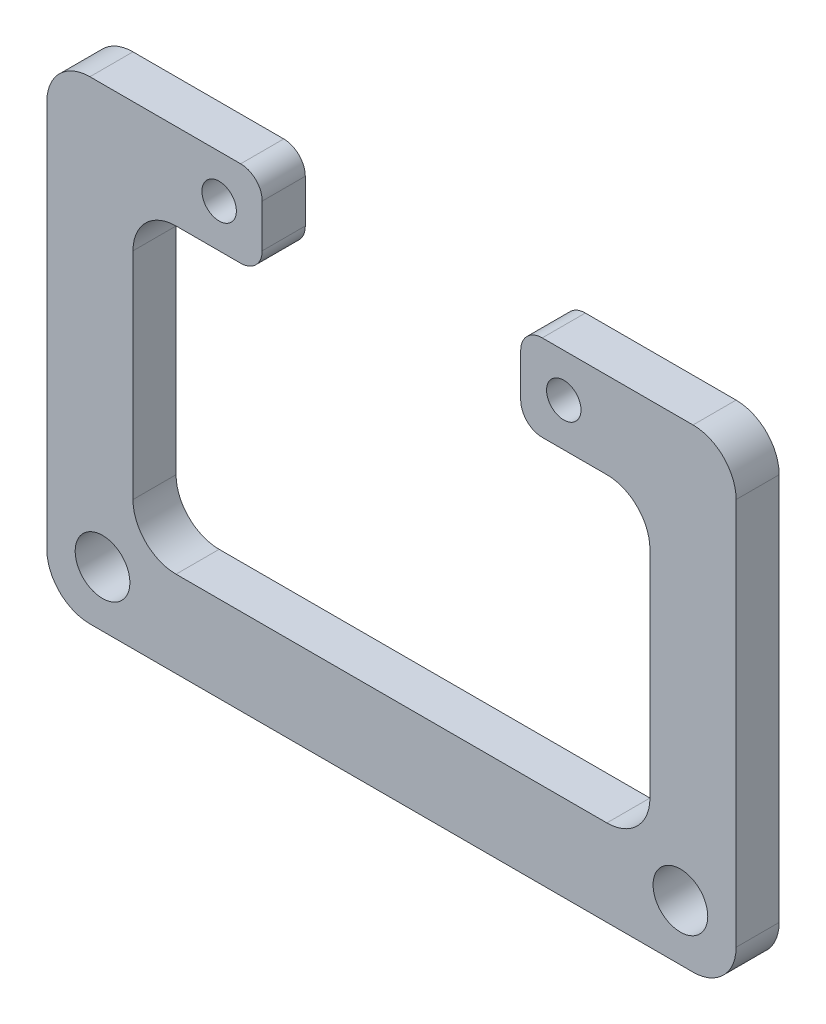
ISO-10303-21;
HEADER;
FILE_DESCRIPTION(('STEP AP214'),'2;1');
FILE_NAME('part.step','',(''),(''),'','','');
FILE_SCHEMA(('AUTOMOTIVE_DESIGN { 1 0 10303 214 1 1 1 1 }'));
ENDSEC;
DATA;
#1=APPLICATION_CONTEXT('core data for automotive mechanical design processes');
#2=APPLICATION_PROTOCOL_DEFINITION('international standard','automotive_design',2000,#1);
#3=PRODUCT_CONTEXT('',#1,'mechanical');
#4=PRODUCT('Part','Part','',(#3));
#5=PRODUCT_RELATED_PRODUCT_CATEGORY('part','',(#4));
#6=PRODUCT_DEFINITION_FORMATION('','',#4);
#7=PRODUCT_DEFINITION_CONTEXT('part definition',#1,'design');
#8=PRODUCT_DEFINITION('design','',#6,#7);
#9=PRODUCT_DEFINITION_SHAPE('','',#8);
#10=(LENGTH_UNIT() NAMED_UNIT(*) SI_UNIT(.MILLI.,.METRE.));
#11=(NAMED_UNIT(*) PLANE_ANGLE_UNIT() SI_UNIT($,.RADIAN.));
#12=(NAMED_UNIT(*) SI_UNIT($,.STERADIAN.) SOLID_ANGLE_UNIT());
#13=UNCERTAINTY_MEASURE_WITH_UNIT(LENGTH_MEASURE(1.E-05),#10,'distance_accuracy_value','');
#14=(GEOMETRIC_REPRESENTATION_CONTEXT(3) GLOBAL_UNCERTAINTY_ASSIGNED_CONTEXT((#13)) GLOBAL_UNIT_ASSIGNED_CONTEXT((#10,
#11,#12)) REPRESENTATION_CONTEXT('',''));
#15=CARTESIAN_POINT('',(0.,0.,0.));
#16=DIRECTION('',(0.,0.,1.));
#17=DIRECTION('',(1.,0.,0.));
#18=AXIS2_PLACEMENT_3D('',#15,#16,#17);
#19=CARTESIAN_POINT('',(0.,0.,-5.));
#20=DIRECTION('',(0.,-1.,0.));
#21=DIRECTION('',(0.,0.,-1.));
#22=AXIS2_PLACEMENT_3D('',#19,#20,#21);
#23=PLANE('',#22);
#24=DIRECTION('',(1.,0.,0.));
#25=VECTOR('',#24,1.);
#26=CARTESIAN_POINT('',(0.,0.,5.));
#27=LINE('',#26,#25);
#28=CARTESIAN_POINT('',(-70.,0.,5.));
#29=VERTEX_POINT('',#28);
#30=CARTESIAN_POINT('',(70.,0.,5.));
#31=VERTEX_POINT('',#30);
#32=EDGE_CURVE('E353',#29,#31,#27,.T.);
#33=ORIENTED_EDGE('',*,*,#32,.F.);
#34=DIRECTION('',(0.,0.,1.));
#35=VECTOR('',#34,1.);
#36=CARTESIAN_POINT('',(-70.,0.,-5.));
#37=LINE('',#36,#35);
#38=CARTESIAN_POINT('',(-70.,0.,-5.));
#39=VERTEX_POINT('',#38);
#40=EDGE_CURVE('E302',#39,#29,#37,.T.);
#41=ORIENTED_EDGE('',*,*,#40,.F.);
#42=DIRECTION('',(1.,0.,0.));
#43=VECTOR('',#42,1.);
#44=CARTESIAN_POINT('',(0.,0.,-5.));
#45=LINE('',#44,#43);
#46=CARTESIAN_POINT('',(70.,0.,-5.));
#47=VERTEX_POINT('',#46);
#48=EDGE_CURVE('E317',#39,#47,#45,.T.);
#49=ORIENTED_EDGE('',*,*,#48,.T.);
#50=DIRECTION('',(0.,0.,1.));
#51=VECTOR('',#50,1.);
#52=CARTESIAN_POINT('',(70.,0.,-5.));
#53=LINE('',#52,#51);
#54=EDGE_CURVE('E349',#47,#31,#53,.T.);
#55=ORIENTED_EDGE('',*,*,#54,.T.);
#56=EDGE_LOOP('',(#33,#41,#49,#55));
#57=FACE_BOUND('',#56,.T.);
#58=ADVANCED_FACE('F47',(#57),#23,.T.);
#59=CARTESIAN_POINT('',(0.,20.,-5.));
#60=DIRECTION('',(0.,1.,0.));
#61=DIRECTION('',(-1.,0.,0.));
#62=AXIS2_PLACEMENT_3D('',#59,#60,#61);
#63=PLANE('',#62);
#64=DIRECTION('',(-1.,0.,0.));
#65=VECTOR('',#64,1.);
#66=CARTESIAN_POINT('',(0.,20.,5.));
#67=LINE('',#66,#65);
#68=CARTESIAN_POINT('',(50.,20.,5.));
#69=VERTEX_POINT('',#68);
#70=CARTESIAN_POINT('',(-50.,20.,5.));
#71=VERTEX_POINT('',#70);
#72=EDGE_CURVE('E383',#69,#71,#67,.T.);
#73=ORIENTED_EDGE('',*,*,#72,.F.);
#74=DIRECTION('',(0.,0.,1.));
#75=VECTOR('',#74,1.);
#76=CARTESIAN_POINT('',(50.,20.,-5.));
#77=LINE('',#76,#75);
#78=CARTESIAN_POINT('',(50.,20.,-5.));
#79=VERTEX_POINT('',#78);
#80=EDGE_CURVE('E217',#79,#69,#77,.T.);
#81=ORIENTED_EDGE('',*,*,#80,.F.);
#82=DIRECTION('',(-1.,0.,0.));
#83=VECTOR('',#82,1.);
#84=CARTESIAN_POINT('',(0.,20.,-5.));
#85=LINE('',#84,#83);
#86=CARTESIAN_POINT('',(-50.,20.,-5.));
#87=VERTEX_POINT('',#86);
#88=EDGE_CURVE('E211',#79,#87,#85,.T.);
#89=ORIENTED_EDGE('',*,*,#88,.T.);
#90=DIRECTION('',(0.,0.,1.));
#91=VECTOR('',#90,1.);
#92=CARTESIAN_POINT('',(-50.,20.,-5.));
#93=LINE('',#92,#91);
#94=EDGE_CURVE('E215',#87,#71,#93,.T.);
#95=ORIENTED_EDGE('',*,*,#94,.T.);
#96=EDGE_LOOP('',(#73,#81,#89,#95));
#97=FACE_BOUND('',#96,.T.);
#98=ADVANCED_FACE('F214',(#97),#63,.T.);
#99=CARTESIAN_POINT('',(50.,30.,-5.));
#100=DIRECTION('',(0.,0.,1.));
#101=DIRECTION('',(1.,0.,0.));
#102=AXIS2_PLACEMENT_3D('',#99,#100,#101);
#103=CYLINDRICAL_SURFACE('',#102,10.);
#104=CARTESIAN_POINT('',(50.,30.,5.));
#105=DIRECTION('',(0.,0.,1.));
#106=DIRECTION('',(1.,0.,0.));
#107=AXIS2_PLACEMENT_3D('',#104,#105,#106);
#108=CIRCLE('',#107,10.);
#109=CARTESIAN_POINT('',(60.,30.,5.));
#110=VERTEX_POINT('',#109);
#111=EDGE_CURVE('E379',#69,#110,#108,.T.);
#112=ORIENTED_EDGE('',*,*,#111,.T.);
#113=DIRECTION('',(0.,0.,1.));
#114=VECTOR('',#113,1.);
#115=CARTESIAN_POINT('',(60.,30.,-5.));
#116=LINE('',#115,#114);
#117=CARTESIAN_POINT('',(60.,30.,-5.));
#118=VERTEX_POINT('',#117);
#119=EDGE_CURVE('E392',#118,#110,#116,.T.);
#120=ORIENTED_EDGE('',*,*,#119,.F.);
#121=CARTESIAN_POINT('',(50.,30.,-5.));
#122=DIRECTION('',(0.,0.,1.));
#123=DIRECTION('',(1.,0.,0.));
#124=AXIS2_PLACEMENT_3D('',#121,#122,#123);
#125=CIRCLE('',#124,10.);
#126=EDGE_CURVE('E223',#79,#118,#125,.T.);
#127=ORIENTED_EDGE('',*,*,#126,.F.);
#128=ORIENTED_EDGE('',*,*,#80,.T.);
#129=EDGE_LOOP('',(#112,#120,#127,#128));
#130=FACE_BOUND('',#129,.T.);
#131=ADVANCED_FACE('F534',(#130),#103,.F.);
#132=CARTESIAN_POINT('',(60.,0.,-5.));
#133=DIRECTION('',(-1.,0.,0.));
#134=DIRECTION('',(0.,-1.,0.));
#135=AXIS2_PLACEMENT_3D('',#132,#133,#134);
#136=PLANE('',#135);
#137=DIRECTION('',(0.,-1.,0.));
#138=VECTOR('',#137,1.);
#139=CARTESIAN_POINT('',(60.,0.,5.));
#140=LINE('',#139,#138);
#141=CARTESIAN_POINT('',(60.,80.,5.));
#142=VERTEX_POINT('',#141);
#143=EDGE_CURVE('E376',#142,#110,#140,.T.);
#144=ORIENTED_EDGE('',*,*,#143,.F.);
#145=DIRECTION('',(0.,0.,1.));
#146=VECTOR('',#145,1.);
#147=CARTESIAN_POINT('',(60.,80.,-5.));
#148=LINE('',#147,#146);
#149=CARTESIAN_POINT('',(60.,80.,-5.));
#150=VERTEX_POINT('',#149);
#151=EDGE_CURVE('E423',#142,#150,#148,.F.);
#152=ORIENTED_EDGE('',*,*,#151,.T.);
#153=DIRECTION('',(0.,-1.,0.));
#154=VECTOR('',#153,1.);
#155=CARTESIAN_POINT('',(60.,0.,-5.));
#156=LINE('',#155,#154);
#157=EDGE_CURVE('E341',#150,#118,#156,.T.);
#158=ORIENTED_EDGE('',*,*,#157,.T.);
#159=ORIENTED_EDGE('',*,*,#119,.T.);
#160=EDGE_LOOP('',(#144,#152,#158,#159));
#161=FACE_BOUND('',#160,.T.);
#162=ADVANCED_FACE('F780',(#161),#136,.T.);
#163=CARTESIAN_POINT('',(0.,90.,-5.));
#164=DIRECTION('',(0.,-1.,0.));
#165=DIRECTION('',(1.,0.,0.));
#166=AXIS2_PLACEMENT_3D('',#163,#164,#165);
#167=PLANE('',#166);
#168=DIRECTION('',(1.,0.,0.));
#169=VECTOR('',#168,1.);
#170=CARTESIAN_POINT('',(0.,90.,5.));
#171=LINE('',#170,#169);
#172=CARTESIAN_POINT('',(35.,90.,5.));
#173=VERTEX_POINT('',#172);
#174=CARTESIAN_POINT('',(50.,90.,5.));
#175=VERTEX_POINT('',#174);
#176=EDGE_CURVE('E373',#173,#175,#171,.T.);
#177=ORIENTED_EDGE('',*,*,#176,.F.);
#178=DIRECTION('',(0.,0.,1.));
#179=VECTOR('',#178,1.);
#180=CARTESIAN_POINT('',(35.,90.,-5.));
#181=LINE('',#180,#179);
#182=CARTESIAN_POINT('',(35.,90.,-5.));
#183=VERTEX_POINT('',#182);
#184=EDGE_CURVE('E63',#173,#183,#181,.F.);
#185=ORIENTED_EDGE('',*,*,#184,.T.);
#186=DIRECTION('',(1.,0.,0.));
#187=VECTOR('',#186,1.);
#188=CARTESIAN_POINT('',(0.,90.,-5.));
#189=LINE('',#188,#187);
#190=CARTESIAN_POINT('',(50.,90.,-5.));
#191=VERTEX_POINT('',#190);
#192=EDGE_CURVE('E338',#183,#191,#189,.T.);
#193=ORIENTED_EDGE('',*,*,#192,.T.);
#194=DIRECTION('',(0.,0.,1.));
#195=VECTOR('',#194,1.);
#196=CARTESIAN_POINT('',(50.,90.,5.));
#197=LINE('',#196,#195);
#198=EDGE_CURVE('E419',#191,#175,#197,.T.);
#199=ORIENTED_EDGE('',*,*,#198,.T.);
#200=EDGE_LOOP('',(#177,#185,#193,#199));
#201=FACE_BOUND('',#200,.T.);
#202=ADVANCED_FACE('F543',(#201),#167,.T.);
#203=CARTESIAN_POINT('',(30.,0.,-5.));
#204=DIRECTION('',(-1.,0.,0.));
#205=DIRECTION('',(0.,0.,1.));
#206=AXIS2_PLACEMENT_3D('',#203,#204,#205);
#207=PLANE('',#206);
#208=DIRECTION('',(0.,-1.,0.));
#209=VECTOR('',#208,1.);
#210=CARTESIAN_POINT('',(30.,0.,5.));
#211=LINE('',#210,#209);
#212=CARTESIAN_POINT('',(30.,105.,5.));
#213=VERTEX_POINT('',#212);
#214=CARTESIAN_POINT('',(30.,95.,5.));
#215=VERTEX_POINT('',#214);
#216=EDGE_CURVE('E369',#213,#215,#211,.T.);
#217=ORIENTED_EDGE('',*,*,#216,.F.);
#218=DIRECTION('',(0.,0.,1.));
#219=VECTOR('',#218,1.);
#220=CARTESIAN_POINT('',(30.,105.,-5.));
#221=LINE('',#220,#219);
#222=CARTESIAN_POINT('',(30.,105.,-5.));
#223=VERTEX_POINT('',#222);
#224=EDGE_CURVE('E475',#213,#223,#221,.F.);
#225=ORIENTED_EDGE('',*,*,#224,.T.);
#226=DIRECTION('',(0.,-1.,0.));
#227=VECTOR('',#226,1.);
#228=CARTESIAN_POINT('',(30.,0.,-5.));
#229=LINE('',#228,#227);
#230=CARTESIAN_POINT('',(30.,95.,-5.));
#231=VERTEX_POINT('',#230);
#232=EDGE_CURVE('E334',#223,#231,#229,.T.);
#233=ORIENTED_EDGE('',*,*,#232,.T.);
#234=DIRECTION('',(0.,0.,1.));
#235=VECTOR('',#234,1.);
#236=CARTESIAN_POINT('',(30.,95.,-5.));
#237=LINE('',#236,#235);
#238=EDGE_CURVE('E471',#231,#215,#237,.T.);
#239=ORIENTED_EDGE('',*,*,#238,.T.);
#240=EDGE_LOOP('',(#217,#225,#233,#239));
#241=FACE_BOUND('',#240,.T.);
#242=ADVANCED_FACE('F550',(#241),#207,.T.);
#243=CARTESIAN_POINT('',(0.,110.,-5.));
#244=DIRECTION('',(0.,1.,0.));
#245=DIRECTION('',(-1.,0.,0.));
#246=AXIS2_PLACEMENT_3D('',#243,#244,#245);
#247=PLANE('',#246);
#248=DIRECTION('',(-1.,0.,0.));
#249=VECTOR('',#248,1.);
#250=CARTESIAN_POINT('',(0.,110.,-5.));
#251=LINE('',#250,#249);
#252=CARTESIAN_POINT('',(70.,110.,-5.));
#253=VERTEX_POINT('',#252);
#254=CARTESIAN_POINT('',(35.,110.,-5.));
#255=VERTEX_POINT('',#254);
#256=EDGE_CURVE('E330',#253,#255,#251,.T.);
#257=ORIENTED_EDGE('',*,*,#256,.T.);
#258=DIRECTION('',(0.,0.,1.));
#259=VECTOR('',#258,1.);
#260=CARTESIAN_POINT('',(35.,110.,-5.));
#261=LINE('',#260,#259);
#262=CARTESIAN_POINT('',(35.,110.,5.));
#263=VERTEX_POINT('',#262);
#264=EDGE_CURVE('E455',#255,#263,#261,.T.);
#265=ORIENTED_EDGE('',*,*,#264,.T.);
#266=DIRECTION('',(-1.,0.,0.));
#267=VECTOR('',#266,1.);
#268=CARTESIAN_POINT('',(0.,110.,5.));
#269=LINE('',#268,#267);
#270=CARTESIAN_POINT('',(70.,110.,5.));
#271=VERTEX_POINT('',#270);
#272=EDGE_CURVE('E365',#271,#263,#269,.T.);
#273=ORIENTED_EDGE('',*,*,#272,.F.);
#274=DIRECTION('',(0.,0.,1.));
#275=VECTOR('',#274,1.);
#276=CARTESIAN_POINT('',(70.,110.,-5.));
#277=LINE('',#276,#275);
#278=EDGE_CURVE('E410',#271,#253,#277,.F.);
#279=ORIENTED_EDGE('',*,*,#278,.T.);
#280=EDGE_LOOP('',(#257,#265,#273,#279));
#281=FACE_BOUND('',#280,.T.);
#282=ADVANCED_FACE('F558',(#281),#247,.T.);
#283=CARTESIAN_POINT('',(80.,0.,-5.));
#284=DIRECTION('',(1.,0.,0.));
#285=DIRECTION('',(0.,1.,0.));
#286=AXIS2_PLACEMENT_3D('',#283,#284,#285);
#287=PLANE('',#286);
#288=DIRECTION('',(0.,1.,0.));
#289=VECTOR('',#288,1.);
#290=CARTESIAN_POINT('',(80.,0.,-5.));
#291=LINE('',#290,#289);
#292=CARTESIAN_POINT('',(80.,10.,-5.));
#293=VERTEX_POINT('',#292);
#294=CARTESIAN_POINT('',(80.,100.,-5.));
#295=VERTEX_POINT('',#294);
#296=EDGE_CURVE('E326',#293,#295,#291,.T.);
#297=ORIENTED_EDGE('',*,*,#296,.T.);
#298=DIRECTION('',(0.,0.,1.));
#299=VECTOR('',#298,1.);
#300=CARTESIAN_POINT('',(80.,100.,-5.));
#301=LINE('',#300,#299);
#302=CARTESIAN_POINT('',(80.,100.,5.));
#303=VERTEX_POINT('',#302);
#304=EDGE_CURVE('E391',#295,#303,#301,.T.);
#305=ORIENTED_EDGE('',*,*,#304,.T.);
#306=DIRECTION('',(0.,1.,0.));
#307=VECTOR('',#306,1.);
#308=CARTESIAN_POINT('',(80.,0.,5.));
#309=LINE('',#308,#307);
#310=CARTESIAN_POINT('',(80.,10.,5.));
#311=VERTEX_POINT('',#310);
#312=EDGE_CURVE('E361',#311,#303,#309,.T.);
#313=ORIENTED_EDGE('',*,*,#312,.F.);
#314=DIRECTION('',(0.,0.,1.));
#315=VECTOR('',#314,1.);
#316=CARTESIAN_POINT('',(80.,10.,-5.));
#317=LINE('',#316,#315);
#318=EDGE_CURVE('E396',#293,#311,#317,.T.);
#319=ORIENTED_EDGE('',*,*,#318,.F.);
#320=EDGE_LOOP('',(#297,#305,#313,#319));
#321=FACE_BOUND('',#320,.T.);
#322=ADVANCED_FACE('F568',(#321),#287,.T.);
#323=CARTESIAN_POINT('',(70.,10.,-5.));
#324=DIRECTION('',(0.,0.,1.));
#325=DIRECTION('',(1.,0.,0.));
#326=AXIS2_PLACEMENT_3D('',#323,#324,#325);
#327=CYLINDRICAL_SURFACE('',#326,10.);
#328=CARTESIAN_POINT('',(70.,10.,5.));
#329=DIRECTION('',(0.,0.,1.));
#330=DIRECTION('',(1.,0.,0.));
#331=AXIS2_PLACEMENT_3D('',#328,#329,#330);
#332=CIRCLE('',#331,10.);
#333=EDGE_CURVE('E357',#31,#311,#332,.T.);
#334=ORIENTED_EDGE('',*,*,#333,.F.);
#335=ORIENTED_EDGE('',*,*,#54,.F.);
#336=CARTESIAN_POINT('',(70.,10.,-5.));
#337=DIRECTION('',(0.,0.,1.));
#338=DIRECTION('',(1.,0.,0.));
#339=AXIS2_PLACEMENT_3D('',#336,#337,#338);
#340=CIRCLE('',#339,10.);
#341=EDGE_CURVE('E322',#47,#293,#340,.T.);
#342=ORIENTED_EDGE('',*,*,#341,.T.);
#343=ORIENTED_EDGE('',*,*,#318,.T.);
#344=EDGE_LOOP('',(#334,#335,#342,#343));
#345=FACE_BOUND('',#344,.T.);
#346=ADVANCED_FACE('F572',(#345),#327,.T.);
#347=CARTESIAN_POINT('',(67.0710678118655,12.9289321881345,-5.));
#348=DIRECTION('',(0.,0.,1.));
#349=DIRECTION('',(1.,0.,0.));
#350=AXIS2_PLACEMENT_3D('',#347,#348,#349);
#351=CYLINDRICAL_SURFACE('',#350,6.35);
#352=CARTESIAN_POINT('',(67.0710678118655,12.9289321881345,-5.));
#353=DIRECTION('',(0.,0.,1.));
#354=DIRECTION('',(1.,0.,0.));
#355=AXIS2_PLACEMENT_3D('',#352,#353,#354);
#356=CIRCLE('',#355,6.35);
#357=CARTESIAN_POINT('',(73.4210678118655,12.9289321881345,-5.));
#358=VERTEX_POINT('',#357);
#359=EDGE_CURVE('E313',#358,#358,#356,.T.);
#360=ORIENTED_EDGE('',*,*,#359,.F.);
#361=EDGE_LOOP('',(#360));
#362=FACE_BOUND('',#361,.T.);
#363=CARTESIAN_POINT('',(67.0710678118655,12.9289321881345,5.));
#364=DIRECTION('',(0.,0.,1.));
#365=DIRECTION('',(1.,0.,0.));
#366=AXIS2_PLACEMENT_3D('',#363,#364,#365);
#367=CIRCLE('',#366,6.35);
#368=CARTESIAN_POINT('',(73.4210678118655,12.9289321881345,5.));
#369=VERTEX_POINT('',#368);
#370=EDGE_CURVE('E306',#369,#369,#367,.T.);
#371=ORIENTED_EDGE('',*,*,#370,.T.);
#372=EDGE_LOOP('',(#371));
#373=FACE_BOUND('',#372,.T.);
#374=ADVANCED_FACE('F607',(#362,#373),#351,.F.);
#375=CARTESIAN_POINT('',(40.,100.,-5.));
#376=DIRECTION('',(0.,0.,1.));
#377=DIRECTION('',(1.,0.,0.));
#378=AXIS2_PLACEMENT_3D('',#375,#376,#377);
#379=CYLINDRICAL_SURFACE('',#378,4.00000000000001);
#380=CARTESIAN_POINT('',(40.,100.,-5.));
#381=DIRECTION('',(0.,0.,1.));
#382=DIRECTION('',(1.,0.,0.));
#383=AXIS2_PLACEMENT_3D('',#380,#381,#382);
#384=CIRCLE('',#383,4.00000000000001);
#385=CARTESIAN_POINT('',(44.,100.,-5.));
#386=VERTEX_POINT('',#385);
#387=EDGE_CURVE('E222',#386,#386,#384,.T.);
#388=ORIENTED_EDGE('',*,*,#387,.F.);
#389=EDGE_LOOP('',(#388));
#390=FACE_BOUND('',#389,.T.);
#391=CARTESIAN_POINT('',(40.,100.,5.));
#392=DIRECTION('',(0.,0.,1.));
#393=DIRECTION('',(1.,0.,0.));
#394=AXIS2_PLACEMENT_3D('',#391,#392,#393);
#395=CIRCLE('',#394,4.00000000000001);
#396=CARTESIAN_POINT('',(44.,100.,5.));
#397=VERTEX_POINT('',#396);
#398=EDGE_CURVE('E318',#397,#397,#395,.T.);
#399=ORIENTED_EDGE('',*,*,#398,.T.);
#400=EDGE_LOOP('',(#399));
#401=FACE_BOUND('',#400,.T.);
#402=ADVANCED_FACE('F610',(#390,#401),#379,.F.);
#403=CARTESIAN_POINT('',(0.,0.,-5.));
#404=DIRECTION('',(0.,0.,1.));
#405=DIRECTION('',(1.,0.,0.));
#406=AXIS2_PLACEMENT_3D('',#403,#404,#405);
#407=PLANE('',#406);
#408=ORIENTED_EDGE('',*,*,#359,.T.);
#409=EDGE_LOOP('',(#408));
#410=FACE_BOUND('',#409,.T.);
#411=ORIENTED_EDGE('',*,*,#232,.F.);
#412=CARTESIAN_POINT('',(35.,105.,-5.));
#413=DIRECTION('',(0.,0.,1.));
#414=DIRECTION('',(1.,0.,0.));
#415=AXIS2_PLACEMENT_3D('',#412,#413,#414);
#416=CIRCLE('',#415,5.);
#417=EDGE_CURVE('E486',#223,#255,#416,.F.);
#418=ORIENTED_EDGE('',*,*,#417,.T.);
#419=ORIENTED_EDGE('',*,*,#256,.F.);
#420=CARTESIAN_POINT('',(70.,100.,-5.));
#421=DIRECTION('',(0.,0.,1.));
#422=DIRECTION('',(1.,0.,0.));
#423=AXIS2_PLACEMENT_3D('',#420,#421,#422);
#424=CIRCLE('',#423,10.);
#425=EDGE_CURVE('E416',#253,#295,#424,.F.);
#426=ORIENTED_EDGE('',*,*,#425,.T.);
#427=ORIENTED_EDGE('',*,*,#296,.F.);
#428=ORIENTED_EDGE('',*,*,#341,.F.);
#429=ORIENTED_EDGE('',*,*,#48,.F.);
#430=CARTESIAN_POINT('',(-70.,10.,-5.));
#431=DIRECTION('',(0.,0.,-1.));
#432=DIRECTION('',(-1.,0.,0.));
#433=AXIS2_PLACEMENT_3D('',#430,#431,#432);
#434=CIRCLE('',#433,10.);
#435=CARTESIAN_POINT('',(-80.,10.,-5.));
#436=VERTEX_POINT('',#435);
#437=EDGE_CURVE('E266',#39,#436,#434,.T.);
#438=ORIENTED_EDGE('',*,*,#437,.T.);
#439=DIRECTION('',(0.,1.,0.));
#440=VECTOR('',#439,1.);
#441=CARTESIAN_POINT('',(-80.,0.,-5.));
#442=LINE('',#441,#440);
#443=CARTESIAN_POINT('',(-80.,100.,-5.));
#444=VERTEX_POINT('',#443);
#445=EDGE_CURVE('E262',#436,#444,#442,.T.);
#446=ORIENTED_EDGE('',*,*,#445,.T.);
#447=CARTESIAN_POINT('',(-70.,100.,-5.));
#448=DIRECTION('',(0.,0.,1.));
#449=DIRECTION('',(1.,0.,0.));
#450=AXIS2_PLACEMENT_3D('',#447,#448,#449);
#451=CIRCLE('',#450,10.);
#452=CARTESIAN_POINT('',(-70.,110.,-5.));
#453=VERTEX_POINT('',#452);
#454=EDGE_CURVE('E413',#444,#453,#451,.F.);
#455=ORIENTED_EDGE('',*,*,#454,.T.);
#456=DIRECTION('',(1.,0.,0.));
#457=VECTOR('',#456,1.);
#458=CARTESIAN_POINT('',(0.,110.,-5.));
#459=LINE('',#458,#457);
#460=CARTESIAN_POINT('',(-35.,110.,-5.));
#461=VERTEX_POINT('',#460);
#462=EDGE_CURVE('E258',#453,#461,#459,.T.);
#463=ORIENTED_EDGE('',*,*,#462,.T.);
#464=CARTESIAN_POINT('',(-35.,105.,-5.));
#465=DIRECTION('',(0.,0.,1.));
#466=DIRECTION('',(1.,0.,0.));
#467=AXIS2_PLACEMENT_3D('',#464,#465,#466);
#468=CIRCLE('',#467,5.);
#469=CARTESIAN_POINT('',(-30.,105.,-5.));
#470=VERTEX_POINT('',#469);
#471=EDGE_CURVE('E480',#461,#470,#468,.F.);
#472=ORIENTED_EDGE('',*,*,#471,.T.);
#473=DIRECTION('',(0.,-1.,0.));
#474=VECTOR('',#473,1.);
#475=CARTESIAN_POINT('',(-30.,0.,-5.));
#476=LINE('',#475,#474);
#477=CARTESIAN_POINT('',(-30.,95.,-5.));
#478=VERTEX_POINT('',#477);
#479=EDGE_CURVE('E255',#470,#478,#476,.T.);
#480=ORIENTED_EDGE('',*,*,#479,.T.);
#481=CARTESIAN_POINT('',(-35.,95.,-5.));
#482=DIRECTION('',(0.,0.,1.));
#483=DIRECTION('',(1.,0.,0.));
#484=AXIS2_PLACEMENT_3D('',#481,#482,#483);
#485=CIRCLE('',#484,5.);
#486=CARTESIAN_POINT('',(-35.,90.,-5.));
#487=VERTEX_POINT('',#486);
#488=EDGE_CURVE('E71',#478,#487,#485,.F.);
#489=ORIENTED_EDGE('',*,*,#488,.T.);
#490=DIRECTION('',(-1.,0.,0.));
#491=VECTOR('',#490,1.);
#492=CARTESIAN_POINT('',(0.,90.,-5.));
#493=LINE('',#492,#491);
#494=CARTESIAN_POINT('',(-50.,90.,-5.));
#495=VERTEX_POINT('',#494);
#496=EDGE_CURVE('E247',#487,#495,#493,.T.);
#497=ORIENTED_EDGE('',*,*,#496,.T.);
#498=CARTESIAN_POINT('',(-50.,80.,-5.));
#499=DIRECTION('',(0.,0.,1.));
#500=DIRECTION('',(1.,0.,0.));
#501=AXIS2_PLACEMENT_3D('',#498,#499,#500);
#502=CIRCLE('',#501,10.);
#503=CARTESIAN_POINT('',(-60.,80.,-5.));
#504=VERTEX_POINT('',#503);
#505=EDGE_CURVE('E452',#495,#504,#502,.T.);
#506=ORIENTED_EDGE('',*,*,#505,.T.);
#507=DIRECTION('',(0.,-1.,0.));
#508=VECTOR('',#507,1.);
#509=CARTESIAN_POINT('',(-60.,0.,-5.));
#510=LINE('',#509,#508);
#511=CARTESIAN_POINT('',(-60.,30.,-5.));
#512=VERTEX_POINT('',#511);
#513=EDGE_CURVE('E240',#504,#512,#510,.T.);
#514=ORIENTED_EDGE('',*,*,#513,.T.);
#515=CARTESIAN_POINT('',(-50.,30.,-5.));
#516=DIRECTION('',(0.,0.,-1.));
#517=DIRECTION('',(-1.,0.,0.));
#518=AXIS2_PLACEMENT_3D('',#515,#516,#517);
#519=CIRCLE('',#518,10.);
#520=EDGE_CURVE('E229',#87,#512,#519,.T.);
#521=ORIENTED_EDGE('',*,*,#520,.F.);
#522=ORIENTED_EDGE('',*,*,#88,.F.);
#523=ORIENTED_EDGE('',*,*,#126,.T.);
#524=ORIENTED_EDGE('',*,*,#157,.F.);
#525=CARTESIAN_POINT('',(50.,80.,-5.));
#526=DIRECTION('',(0.,0.,1.));
#527=DIRECTION('',(1.,0.,0.));
#528=AXIS2_PLACEMENT_3D('',#525,#526,#527);
#529=CIRCLE('',#528,10.);
#530=EDGE_CURVE('E444',#150,#191,#529,.T.);
#531=ORIENTED_EDGE('',*,*,#530,.T.);
#532=ORIENTED_EDGE('',*,*,#192,.F.);
#533=CARTESIAN_POINT('',(35.,95.,-5.));
#534=DIRECTION('',(0.,0.,1.));
#535=DIRECTION('',(1.,0.,0.));
#536=AXIS2_PLACEMENT_3D('',#533,#534,#535);
#537=CIRCLE('',#536,5.);
#538=EDGE_CURVE('E483',#183,#231,#537,.F.);
#539=ORIENTED_EDGE('',*,*,#538,.T.);
#540=EDGE_LOOP('',(#411,#418,#419,#426,#427,#428,#429,#438,#446,#455,#463,#472,#480,#489,#497,
#506,#514,#521,#522,#523,#524,#531,#532,#539));
#541=FACE_BOUND('',#540,.T.);
#542=ORIENTED_EDGE('',*,*,#387,.T.);
#543=EDGE_LOOP('',(#542));
#544=FACE_BOUND('',#543,.T.);
#545=CARTESIAN_POINT('',(-67.0710678118655,12.9289321881345,-5.));
#546=DIRECTION('',(0.,0.,-1.));
#547=DIRECTION('',(-1.,0.,0.));
#548=AXIS2_PLACEMENT_3D('',#545,#546,#547);
#549=CIRCLE('',#548,6.35);
#550=CARTESIAN_POINT('',(-73.4210678118655,12.9289321881345,-5.));
#551=VERTEX_POINT('',#550);
#552=EDGE_CURVE('E243',#551,#551,#549,.T.);
#553=ORIENTED_EDGE('',*,*,#552,.F.);
#554=EDGE_LOOP('',(#553));
#555=FACE_BOUND('',#554,.T.);
#556=CARTESIAN_POINT('',(-40.,100.,-5.));
#557=DIRECTION('',(0.,0.,-1.));
#558=DIRECTION('',(-1.,0.,0.));
#559=AXIS2_PLACEMENT_3D('',#556,#557,#558);
#560=CIRCLE('',#559,4.00000000000001);
#561=CARTESIAN_POINT('',(-44.,100.,-5.));
#562=VERTEX_POINT('',#561);
#563=EDGE_CURVE('E234',#562,#562,#560,.T.);
#564=ORIENTED_EDGE('',*,*,#563,.F.);
#565=EDGE_LOOP('',(#564));
#566=FACE_BOUND('',#565,.T.);
#567=ADVANCED_FACE('F237',(#410,#541,#544,#555,#566),#407,.F.);
#568=CARTESIAN_POINT('',(0.,0.,5.));
#569=DIRECTION('',(0.,0.,1.));
#570=DIRECTION('',(1.,0.,0.));
#571=AXIS2_PLACEMENT_3D('',#568,#569,#570);
#572=PLANE('',#571);
#573=ORIENTED_EDGE('',*,*,#370,.F.);
#574=EDGE_LOOP('',(#573));
#575=FACE_BOUND('',#574,.T.);
#576=ORIENTED_EDGE('',*,*,#272,.T.);
#577=CARTESIAN_POINT('',(35.,105.,5.));
#578=DIRECTION('',(0.,0.,1.));
#579=DIRECTION('',(1.,0.,0.));
#580=AXIS2_PLACEMENT_3D('',#577,#578,#579);
#581=CIRCLE('',#580,5.);
#582=EDGE_CURVE('E468',#263,#213,#581,.T.);
#583=ORIENTED_EDGE('',*,*,#582,.T.);
#584=ORIENTED_EDGE('',*,*,#216,.T.);
#585=CARTESIAN_POINT('',(35.,95.,5.));
#586=DIRECTION('',(0.,0.,1.));
#587=DIRECTION('',(1.,0.,0.));
#588=AXIS2_PLACEMENT_3D('',#585,#586,#587);
#589=CIRCLE('',#588,5.);
#590=EDGE_CURVE('E465',#215,#173,#589,.T.);
#591=ORIENTED_EDGE('',*,*,#590,.T.);
#592=ORIENTED_EDGE('',*,*,#176,.T.);
#593=CARTESIAN_POINT('',(50.,80.,5.));
#594=DIRECTION('',(0.,0.,1.));
#595=DIRECTION('',(1.,0.,0.));
#596=AXIS2_PLACEMENT_3D('',#593,#594,#595);
#597=CIRCLE('',#596,10.);
#598=EDGE_CURVE('E441',#175,#142,#597,.F.);
#599=ORIENTED_EDGE('',*,*,#598,.T.);
#600=ORIENTED_EDGE('',*,*,#143,.T.);
#601=ORIENTED_EDGE('',*,*,#111,.F.);
#602=ORIENTED_EDGE('',*,*,#72,.T.);
#603=CARTESIAN_POINT('',(-50.,30.,5.));
#604=DIRECTION('',(0.,0.,-1.));
#605=DIRECTION('',(-1.,0.,0.));
#606=AXIS2_PLACEMENT_3D('',#603,#604,#605);
#607=CIRCLE('',#606,10.);
#608=CARTESIAN_POINT('',(-60.,30.,5.));
#609=VERTEX_POINT('',#608);
#610=EDGE_CURVE('E231',#71,#609,#607,.T.);
#611=ORIENTED_EDGE('',*,*,#610,.T.);
#612=DIRECTION('',(0.,-1.,0.));
#613=VECTOR('',#612,1.);
#614=CARTESIAN_POINT('',(-60.,0.,5.));
#615=LINE('',#614,#613);
#616=CARTESIAN_POINT('',(-60.,80.,5.));
#617=VERTEX_POINT('',#616);
#618=EDGE_CURVE('E278',#617,#609,#615,.T.);
#619=ORIENTED_EDGE('',*,*,#618,.F.);
#620=CARTESIAN_POINT('',(-50.,80.,5.));
#621=DIRECTION('',(0.,0.,1.));
#622=DIRECTION('',(1.,0.,0.));
#623=AXIS2_PLACEMENT_3D('',#620,#621,#622);
#624=CIRCLE('',#623,10.);
#625=CARTESIAN_POINT('',(-50.,90.,5.));
#626=VERTEX_POINT('',#625);
#627=EDGE_CURVE('E448',#617,#626,#624,.F.);
#628=ORIENTED_EDGE('',*,*,#627,.T.);
#629=DIRECTION('',(-1.,0.,0.));
#630=VECTOR('',#629,1.);
#631=CARTESIAN_POINT('',(0.,90.,5.));
#632=LINE('',#631,#630);
#633=CARTESIAN_POINT('',(-35.,90.,5.));
#634=VERTEX_POINT('',#633);
#635=EDGE_CURVE('E281',#634,#626,#632,.T.);
#636=ORIENTED_EDGE('',*,*,#635,.F.);
#637=CARTESIAN_POINT('',(-35.,95.,5.));
#638=DIRECTION('',(0.,0.,1.));
#639=DIRECTION('',(1.,0.,0.));
#640=AXIS2_PLACEMENT_3D('',#637,#638,#639);
#641=CIRCLE('',#640,5.);
#642=CARTESIAN_POINT('',(-30.,95.,5.));
#643=VERTEX_POINT('',#642);
#644=EDGE_CURVE('E459',#634,#643,#641,.T.);
#645=ORIENTED_EDGE('',*,*,#644,.T.);
#646=DIRECTION('',(0.,-1.,0.));
#647=VECTOR('',#646,1.);
#648=CARTESIAN_POINT('',(-30.,0.,5.));
#649=LINE('',#648,#647);
#650=CARTESIAN_POINT('',(-30.,105.,5.));
#651=VERTEX_POINT('',#650);
#652=EDGE_CURVE('E284',#651,#643,#649,.T.);
#653=ORIENTED_EDGE('',*,*,#652,.F.);
#654=CARTESIAN_POINT('',(-35.,105.,5.));
#655=DIRECTION('',(0.,0.,1.));
#656=DIRECTION('',(1.,0.,0.));
#657=AXIS2_PLACEMENT_3D('',#654,#655,#656);
#658=CIRCLE('',#657,5.);
#659=CARTESIAN_POINT('',(-35.,110.,5.));
#660=VERTEX_POINT('',#659);
#661=EDGE_CURVE('E462',#651,#660,#658,.T.);
#662=ORIENTED_EDGE('',*,*,#661,.T.);
#663=DIRECTION('',(1.,0.,0.));
#664=VECTOR('',#663,1.);
#665=CARTESIAN_POINT('',(0.,110.,5.));
#666=LINE('',#665,#664);
#667=CARTESIAN_POINT('',(-70.,110.,5.));
#668=VERTEX_POINT('',#667);
#669=EDGE_CURVE('E288',#668,#660,#666,.T.);
#670=ORIENTED_EDGE('',*,*,#669,.F.);
#671=CARTESIAN_POINT('',(-70.,100.,5.));
#672=DIRECTION('',(0.,0.,1.));
#673=DIRECTION('',(1.,0.,0.));
#674=AXIS2_PLACEMENT_3D('',#671,#672,#673);
#675=CIRCLE('',#674,10.);
#676=CARTESIAN_POINT('',(-80.,100.,5.));
#677=VERTEX_POINT('',#676);
#678=EDGE_CURVE('E404',#668,#677,#675,.T.);
#679=ORIENTED_EDGE('',*,*,#678,.T.);
#680=DIRECTION('',(0.,1.,0.));
#681=VECTOR('',#680,1.);
#682=CARTESIAN_POINT('',(-80.,0.,5.));
#683=LINE('',#682,#681);
#684=CARTESIAN_POINT('',(-80.,10.,5.));
#685=VERTEX_POINT('',#684);
#686=EDGE_CURVE('E292',#685,#677,#683,.T.);
#687=ORIENTED_EDGE('',*,*,#686,.F.);
#688=CARTESIAN_POINT('',(-70.,10.,5.));
#689=DIRECTION('',(0.,0.,-1.));
#690=DIRECTION('',(-1.,0.,0.));
#691=AXIS2_PLACEMENT_3D('',#688,#689,#690);
#692=CIRCLE('',#691,10.);
#693=EDGE_CURVE('E296',#29,#685,#692,.T.);
#694=ORIENTED_EDGE('',*,*,#693,.F.);
#695=ORIENTED_EDGE('',*,*,#32,.T.);
#696=ORIENTED_EDGE('',*,*,#333,.T.);
#697=ORIENTED_EDGE('',*,*,#312,.T.);
#698=CARTESIAN_POINT('',(70.,100.,5.));
#699=DIRECTION('',(0.,0.,1.));
#700=DIRECTION('',(1.,0.,0.));
#701=AXIS2_PLACEMENT_3D('',#698,#699,#700);
#702=CIRCLE('',#701,10.);
#703=EDGE_CURVE('E407',#303,#271,#702,.T.);
#704=ORIENTED_EDGE('',*,*,#703,.T.);
#705=EDGE_LOOP('',(#576,#583,#584,#591,#592,#599,#600,#601,#602,#611,#619,#628,#636,#645,#653,
#662,#670,#679,#687,#694,#695,#696,#697,#704));
#706=FACE_BOUND('',#705,.T.);
#707=ORIENTED_EDGE('',*,*,#398,.F.);
#708=EDGE_LOOP('',(#707));
#709=FACE_BOUND('',#708,.T.);
#710=CARTESIAN_POINT('',(-67.0710678118655,12.9289321881345,5.));
#711=DIRECTION('',(0.,0.,-1.));
#712=DIRECTION('',(-1.,0.,0.));
#713=AXIS2_PLACEMENT_3D('',#710,#711,#712);
#714=CIRCLE('',#713,6.35);
#715=CARTESIAN_POINT('',(-73.4210678118655,12.9289321881345,5.));
#716=VERTEX_POINT('',#715);
#717=EDGE_CURVE('E272',#716,#716,#714,.T.);
#718=ORIENTED_EDGE('',*,*,#717,.T.);
#719=EDGE_LOOP('',(#718));
#720=FACE_BOUND('',#719,.T.);
#721=CARTESIAN_POINT('',(-40.,100.,5.));
#722=DIRECTION('',(0.,0.,-1.));
#723=DIRECTION('',(-1.,0.,0.));
#724=AXIS2_PLACEMENT_3D('',#721,#722,#723);
#725=CIRCLE('',#724,4.00000000000001);
#726=CARTESIAN_POINT('',(-44.,100.,5.));
#727=VERTEX_POINT('',#726);
#728=EDGE_CURVE('E250',#727,#727,#725,.T.);
#729=ORIENTED_EDGE('',*,*,#728,.T.);
#730=EDGE_LOOP('',(#729));
#731=FACE_BOUND('',#730,.T.);
#732=ADVANCED_FACE('F515',(#575,#706,#709,#720,#731),#572,.T.);
#733=CARTESIAN_POINT('',(-70.,10.,-5.));
#734=DIRECTION('',(0.,0.,1.));
#735=DIRECTION('',(1.,0.,0.));
#736=AXIS2_PLACEMENT_3D('',#733,#734,#735);
#737=CYLINDRICAL_SURFACE('',#736,10.);
#738=ORIENTED_EDGE('',*,*,#693,.T.);
#739=DIRECTION('',(0.,0.,1.));
#740=VECTOR('',#739,1.);
#741=CARTESIAN_POINT('',(-80.,10.,-5.));
#742=LINE('',#741,#740);
#743=EDGE_CURVE('E307',#436,#685,#742,.T.);
#744=ORIENTED_EDGE('',*,*,#743,.F.);
#745=ORIENTED_EDGE('',*,*,#437,.F.);
#746=ORIENTED_EDGE('',*,*,#40,.T.);
#747=EDGE_LOOP('',(#738,#744,#745,#746));
#748=FACE_BOUND('',#747,.T.);
#749=ADVANCED_FACE('F578',(#748),#737,.T.);
#750=CARTESIAN_POINT('',(-80.,0.,-5.));
#751=DIRECTION('',(1.,0.,0.));
#752=DIRECTION('',(0.,1.,0.));
#753=AXIS2_PLACEMENT_3D('',#750,#751,#752);
#754=PLANE('',#753);
#755=ORIENTED_EDGE('',*,*,#686,.T.);
#756=DIRECTION('',(0.,0.,1.));
#757=VECTOR('',#756,1.);
#758=CARTESIAN_POINT('',(-80.,100.,-5.));
#759=LINE('',#758,#757);
#760=EDGE_CURVE('E438',#677,#444,#759,.F.);
#761=ORIENTED_EDGE('',*,*,#760,.T.);
#762=ORIENTED_EDGE('',*,*,#445,.F.);
#763=ORIENTED_EDGE('',*,*,#743,.T.);
#764=EDGE_LOOP('',(#755,#761,#762,#763));
#765=FACE_BOUND('',#764,.T.);
#766=ADVANCED_FACE('F586',(#765),#754,.F.);
#767=CARTESIAN_POINT('',(0.,110.,-5.));
#768=DIRECTION('',(0.,-1.,0.));
#769=DIRECTION('',(1.,0.,0.));
#770=AXIS2_PLACEMENT_3D('',#767,#768,#769);
#771=PLANE('',#770);
#772=ORIENTED_EDGE('',*,*,#669,.T.);
#773=DIRECTION('',(0.,0.,1.));
#774=VECTOR('',#773,1.);
#775=CARTESIAN_POINT('',(-35.,110.,-5.));
#776=LINE('',#775,#774);
#777=EDGE_CURVE('E56',#660,#461,#776,.F.);
#778=ORIENTED_EDGE('',*,*,#777,.T.);
#779=ORIENTED_EDGE('',*,*,#462,.F.);
#780=DIRECTION('',(0.,0.,1.));
#781=VECTOR('',#780,1.);
#782=CARTESIAN_POINT('',(-70.,110.,-5.));
#783=LINE('',#782,#781);
#784=EDGE_CURVE('E434',#453,#668,#783,.T.);
#785=ORIENTED_EDGE('',*,*,#784,.T.);
#786=EDGE_LOOP('',(#772,#778,#779,#785));
#787=FACE_BOUND('',#786,.T.);
#788=ADVANCED_FACE('F501',(#787),#771,.F.);
#789=CARTESIAN_POINT('',(-30.,0.,-5.));
#790=DIRECTION('',(-1.,0.,0.));
#791=DIRECTION('',(0.,0.,1.));
#792=AXIS2_PLACEMENT_3D('',#789,#790,#791);
#793=PLANE('',#792);
#794=ORIENTED_EDGE('',*,*,#479,.F.);
#795=DIRECTION('',(0.,0.,1.));
#796=VECTOR('',#795,1.);
#797=CARTESIAN_POINT('',(-30.,105.,-5.));
#798=LINE('',#797,#796);
#799=EDGE_CURVE('E494',#470,#651,#798,.T.);
#800=ORIENTED_EDGE('',*,*,#799,.T.);
#801=ORIENTED_EDGE('',*,*,#652,.T.);
#802=DIRECTION('',(0.,0.,1.));
#803=VECTOR('',#802,1.);
#804=CARTESIAN_POINT('',(-30.,95.,-5.));
#805=LINE('',#804,#803);
#806=EDGE_CURVE('E491',#643,#478,#805,.F.);
#807=ORIENTED_EDGE('',*,*,#806,.T.);
#808=EDGE_LOOP('',(#794,#800,#801,#807));
#809=FACE_BOUND('',#808,.T.);
#810=ADVANCED_FACE('F512',(#809),#793,.F.);
#811=CARTESIAN_POINT('',(0.,90.,-5.));
#812=DIRECTION('',(0.,1.,0.));
#813=DIRECTION('',(-1.,0.,0.));
#814=AXIS2_PLACEMENT_3D('',#811,#812,#813);
#815=PLANE('',#814);
#816=ORIENTED_EDGE('',*,*,#496,.F.);
#817=DIRECTION('',(0.,0.,1.));
#818=VECTOR('',#817,1.);
#819=CARTESIAN_POINT('',(-35.,90.,-5.));
#820=LINE('',#819,#818);
#821=EDGE_CURVE('E11',#487,#634,#820,.T.);
#822=ORIENTED_EDGE('',*,*,#821,.T.);
#823=ORIENTED_EDGE('',*,*,#635,.T.);
#824=DIRECTION('',(0.,0.,1.));
#825=VECTOR('',#824,1.);
#826=CARTESIAN_POINT('',(-50.,90.,-5.));
#827=LINE('',#826,#825);
#828=EDGE_CURVE('E430',#626,#495,#827,.F.);
#829=ORIENTED_EDGE('',*,*,#828,.T.);
#830=EDGE_LOOP('',(#816,#822,#823,#829));
#831=FACE_BOUND('',#830,.T.);
#832=ADVANCED_FACE('F521',(#831),#815,.F.);
#833=CARTESIAN_POINT('',(-60.,0.,-5.));
#834=DIRECTION('',(-1.,0.,0.));
#835=DIRECTION('',(0.,-1.,0.));
#836=AXIS2_PLACEMENT_3D('',#833,#834,#835);
#837=PLANE('',#836);
#838=ORIENTED_EDGE('',*,*,#513,.F.);
#839=DIRECTION('',(0.,0.,1.));
#840=VECTOR('',#839,1.);
#841=CARTESIAN_POINT('',(-60.,80.,5.));
#842=LINE('',#841,#840);
#843=EDGE_CURVE('E426',#504,#617,#842,.T.);
#844=ORIENTED_EDGE('',*,*,#843,.T.);
#845=ORIENTED_EDGE('',*,*,#618,.T.);
#846=DIRECTION('',(0.,0.,1.));
#847=VECTOR('',#846,1.);
#848=CARTESIAN_POINT('',(-60.,30.,-5.));
#849=LINE('',#848,#847);
#850=EDGE_CURVE('E233',#512,#609,#849,.T.);
#851=ORIENTED_EDGE('',*,*,#850,.F.);
#852=EDGE_LOOP('',(#838,#844,#845,#851));
#853=FACE_BOUND('',#852,.T.);
#854=ADVANCED_FACE('F527',(#853),#837,.F.);
#855=CARTESIAN_POINT('',(-50.,30.,-5.));
#856=DIRECTION('',(0.,0.,1.));
#857=DIRECTION('',(1.,0.,0.));
#858=AXIS2_PLACEMENT_3D('',#855,#856,#857);
#859=CYLINDRICAL_SURFACE('',#858,10.);
#860=ORIENTED_EDGE('',*,*,#610,.F.);
#861=ORIENTED_EDGE('',*,*,#94,.F.);
#862=ORIENTED_EDGE('',*,*,#520,.T.);
#863=ORIENTED_EDGE('',*,*,#850,.T.);
#864=EDGE_LOOP('',(#860,#861,#862,#863));
#865=FACE_BOUND('',#864,.T.);
#866=ADVANCED_FACE('F227',(#865),#859,.F.);
#867=CARTESIAN_POINT('',(-67.0710678118655,12.9289321881345,-5.));
#868=DIRECTION('',(0.,0.,1.));
#869=DIRECTION('',(1.,0.,0.));
#870=AXIS2_PLACEMENT_3D('',#867,#868,#869);
#871=CYLINDRICAL_SURFACE('',#870,6.35);
#872=ORIENTED_EDGE('',*,*,#552,.T.);
#873=EDGE_LOOP('',(#872));
#874=FACE_BOUND('',#873,.T.);
#875=ORIENTED_EDGE('',*,*,#717,.F.);
#876=EDGE_LOOP('',(#875));
#877=FACE_BOUND('',#876,.T.);
#878=ADVANCED_FACE('F682',(#874,#877),#871,.F.);
#879=CARTESIAN_POINT('',(-40.,100.,-5.));
#880=DIRECTION('',(0.,0.,1.));
#881=DIRECTION('',(1.,0.,0.));
#882=AXIS2_PLACEMENT_3D('',#879,#880,#881);
#883=CYLINDRICAL_SURFACE('',#882,4.00000000000001);
#884=ORIENTED_EDGE('',*,*,#563,.T.);
#885=EDGE_LOOP('',(#884));
#886=FACE_BOUND('',#885,.T.);
#887=ORIENTED_EDGE('',*,*,#728,.F.);
#888=EDGE_LOOP('',(#887));
#889=FACE_BOUND('',#888,.T.);
#890=ADVANCED_FACE('F614',(#886,#889),#883,.F.);
#891=CARTESIAN_POINT('',(70.,100.,-5.));
#892=DIRECTION('',(0.,0.,1.));
#893=DIRECTION('',(1.,0.,0.));
#894=AXIS2_PLACEMENT_3D('',#891,#892,#893);
#895=CYLINDRICAL_SURFACE('',#894,10.);
#896=ORIENTED_EDGE('',*,*,#425,.F.);
#897=ORIENTED_EDGE('',*,*,#278,.F.);
#898=ORIENTED_EDGE('',*,*,#703,.F.);
#899=ORIENTED_EDGE('',*,*,#304,.F.);
#900=EDGE_LOOP('',(#896,#897,#898,#899));
#901=FACE_BOUND('',#900,.T.);
#902=ADVANCED_FACE('F565',(#901),#895,.T.);
#903=CARTESIAN_POINT('',(50.,80.,-5.));
#904=DIRECTION('',(0.,0.,-1.));
#905=DIRECTION('',(-1.,0.,0.));
#906=AXIS2_PLACEMENT_3D('',#903,#904,#905);
#907=CYLINDRICAL_SURFACE('',#906,10.);
#908=ORIENTED_EDGE('',*,*,#530,.F.);
#909=ORIENTED_EDGE('',*,*,#151,.F.);
#910=ORIENTED_EDGE('',*,*,#598,.F.);
#911=ORIENTED_EDGE('',*,*,#198,.F.);
#912=EDGE_LOOP('',(#908,#909,#910,#911));
#913=FACE_BOUND('',#912,.T.);
#914=ADVANCED_FACE('F541',(#913),#907,.F.);
#915=CARTESIAN_POINT('',(-50.,80.,-5.));
#916=DIRECTION('',(0.,0.,-1.));
#917=DIRECTION('',(-1.,0.,0.));
#918=AXIS2_PLACEMENT_3D('',#915,#916,#917);
#919=CYLINDRICAL_SURFACE('',#918,10.);
#920=ORIENTED_EDGE('',*,*,#505,.F.);
#921=ORIENTED_EDGE('',*,*,#828,.F.);
#922=ORIENTED_EDGE('',*,*,#627,.F.);
#923=ORIENTED_EDGE('',*,*,#843,.F.);
#924=EDGE_LOOP('',(#920,#921,#922,#923));
#925=FACE_BOUND('',#924,.T.);
#926=ADVANCED_FACE('F529',(#925),#919,.F.);
#927=CARTESIAN_POINT('',(-70.,100.,-5.));
#928=DIRECTION('',(0.,0.,1.));
#929=DIRECTION('',(1.,0.,0.));
#930=AXIS2_PLACEMENT_3D('',#927,#928,#929);
#931=CYLINDRICAL_SURFACE('',#930,10.);
#932=ORIENTED_EDGE('',*,*,#454,.F.);
#933=ORIENTED_EDGE('',*,*,#760,.F.);
#934=ORIENTED_EDGE('',*,*,#678,.F.);
#935=ORIENTED_EDGE('',*,*,#784,.F.);
#936=EDGE_LOOP('',(#932,#933,#934,#935));
#937=FACE_BOUND('',#936,.T.);
#938=ADVANCED_FACE('F584',(#937),#931,.T.);
#939=CARTESIAN_POINT('',(35.,105.,-5.));
#940=DIRECTION('',(0.,0.,1.));
#941=DIRECTION('',(1.,0.,0.));
#942=AXIS2_PLACEMENT_3D('',#939,#940,#941);
#943=CYLINDRICAL_SURFACE('',#942,5.);
#944=ORIENTED_EDGE('',*,*,#417,.F.);
#945=ORIENTED_EDGE('',*,*,#224,.F.);
#946=ORIENTED_EDGE('',*,*,#582,.F.);
#947=ORIENTED_EDGE('',*,*,#264,.F.);
#948=EDGE_LOOP('',(#944,#945,#946,#947));
#949=FACE_BOUND('',#948,.T.);
#950=ADVANCED_FACE('F556',(#949),#943,.T.);
#951=CARTESIAN_POINT('',(35.,95.,-5.));
#952=DIRECTION('',(0.,0.,1.));
#953=DIRECTION('',(1.,0.,0.));
#954=AXIS2_PLACEMENT_3D('',#951,#952,#953);
#955=CYLINDRICAL_SURFACE('',#954,5.);
#956=ORIENTED_EDGE('',*,*,#538,.F.);
#957=ORIENTED_EDGE('',*,*,#184,.F.);
#958=ORIENTED_EDGE('',*,*,#590,.F.);
#959=ORIENTED_EDGE('',*,*,#238,.F.);
#960=EDGE_LOOP('',(#956,#957,#958,#959));
#961=FACE_BOUND('',#960,.T.);
#962=ADVANCED_FACE('F547',(#961),#955,.T.);
#963=CARTESIAN_POINT('',(-35.,105.,-5.));
#964=DIRECTION('',(0.,0.,1.));
#965=DIRECTION('',(1.,0.,0.));
#966=AXIS2_PLACEMENT_3D('',#963,#964,#965);
#967=CYLINDRICAL_SURFACE('',#966,5.);
#968=ORIENTED_EDGE('',*,*,#471,.F.);
#969=ORIENTED_EDGE('',*,*,#777,.F.);
#970=ORIENTED_EDGE('',*,*,#661,.F.);
#971=ORIENTED_EDGE('',*,*,#799,.F.);
#972=EDGE_LOOP('',(#968,#969,#970,#971));
#973=FACE_BOUND('',#972,.T.);
#974=ADVANCED_FACE('F509',(#973),#967,.T.);
#975=CARTESIAN_POINT('',(-35.,95.,-5.));
#976=DIRECTION('',(0.,0.,1.));
#977=DIRECTION('',(1.,0.,0.));
#978=AXIS2_PLACEMENT_3D('',#975,#976,#977);
#979=CYLINDRICAL_SURFACE('',#978,5.);
#980=ORIENTED_EDGE('',*,*,#488,.F.);
#981=ORIENTED_EDGE('',*,*,#806,.F.);
#982=ORIENTED_EDGE('',*,*,#644,.F.);
#983=ORIENTED_EDGE('',*,*,#821,.F.);
#984=EDGE_LOOP('',(#980,#981,#982,#983));
#985=FACE_BOUND('',#984,.T.);
#986=ADVANCED_FACE('F49',(#985),#979,.T.);
#987=CLOSED_SHELL('',(#58,#98,#131,#162,#202,#242,#282,#322,#346,#374,#402,#567,#732,#749,#766,
#788,#810,#832,#854,#866,#878,#890,#902,#914,#926,#938,#950,#962,#974,#986));
#988=MANIFOLD_SOLID_BREP('B2',#987);
#989=ADVANCED_BREP_SHAPE_REPRESENTATION('',(#18,#988),#14);
#990=SHAPE_DEFINITION_REPRESENTATION(#9,#989);
ENDSEC;
END-ISO-10303-21;
